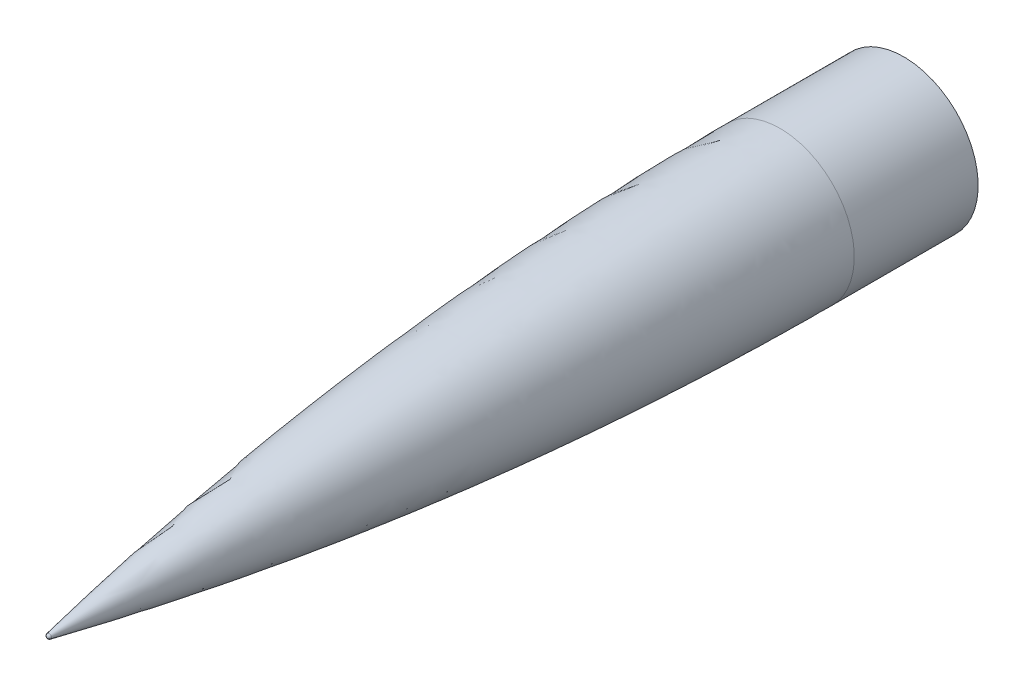
ISO-10303-21;
HEADER;
FILE_DESCRIPTION(('STEP AP214'),'2;1');
FILE_NAME('part.step','',(''),(''),'','','');
FILE_SCHEMA(('AUTOMOTIVE_DESIGN { 1 0 10303 214 1 1 1 1 }'));
ENDSEC;
DATA;
#1=APPLICATION_CONTEXT('core data for automotive mechanical design processes');
#2=APPLICATION_PROTOCOL_DEFINITION('international standard','automotive_design',2000,#1);
#3=PRODUCT_CONTEXT('',#1,'mechanical');
#4=PRODUCT('Part','Part','',(#3));
#5=PRODUCT_RELATED_PRODUCT_CATEGORY('part','',(#4));
#6=PRODUCT_DEFINITION_FORMATION('','',#4);
#7=PRODUCT_DEFINITION_CONTEXT('part definition',#1,'design');
#8=PRODUCT_DEFINITION('design','',#6,#7);
#9=PRODUCT_DEFINITION_SHAPE('','',#8);
#10=(LENGTH_UNIT() NAMED_UNIT(*) SI_UNIT(.MILLI.,.METRE.));
#11=(NAMED_UNIT(*) PLANE_ANGLE_UNIT() SI_UNIT($,.RADIAN.));
#12=(NAMED_UNIT(*) SI_UNIT($,.STERADIAN.) SOLID_ANGLE_UNIT());
#13=UNCERTAINTY_MEASURE_WITH_UNIT(LENGTH_MEASURE(1.E-05),#10,'distance_accuracy_value','');
#14=(GEOMETRIC_REPRESENTATION_CONTEXT(3) GLOBAL_UNCERTAINTY_ASSIGNED_CONTEXT((#13)) GLOBAL_UNIT_ASSIGNED_CONTEXT((#10,
#11,#12)) REPRESENTATION_CONTEXT('',''));
#15=CARTESIAN_POINT('',(0.,0.,0.));
#16=DIRECTION('',(0.,0.,1.));
#17=DIRECTION('',(1.,0.,0.));
#18=AXIS2_PLACEMENT_3D('',#15,#16,#17);
#19=CARTESIAN_POINT('',(0.,76.2,-761.999999999997));
#20=CARTESIAN_POINT('',(0.,76.2,-760.928515031507));
#21=CARTESIAN_POINT('',(0.,76.1988565486631,-758.769681778841));
#22=CARTESIAN_POINT('',(0.,76.1937110176368,-754.154681276467));
#23=CARTESIAN_POINT('',(0.,76.1799896137996,-749.129567883535));
#24=CARTESIAN_POINT('',(0.,76.1594075386224,-744.039048308152));
#25=CARTESIAN_POINT('',(0.,76.1319648287996,-738.871542800412));
#26=CARTESIAN_POINT('',(0.,76.0976615332596,-733.741383177975));
#27=CARTESIAN_POINT('',(0.,76.0564977131606,-728.602410654143));
#28=CARTESIAN_POINT('',(0.,76.0143442179768,-724.092480203886));
#29=CARTESIAN_POINT('',(0.,75.9737232495226,-720.210790809596));
#30=CARTESIAN_POINT('',(0.,75.9292872692357,-716.30085008793));
#31=CARTESIAN_POINT('',(0.,75.8648332430719,-711.049872160127));
#32=CARTESIAN_POINT('',(0.,75.4370504777727,-680.201058153923));
#33=CARTESIAN_POINT('',(0.,73.2972360298675,-592.262717593109));
#34=CARTESIAN_POINT('',(0.,66.0206944697555,-458.506155710729));
#35=CARTESIAN_POINT('',(0.,51.0953693432975,-309.513452377572));
#36=CARTESIAN_POINT('',(0.,32.4335979388166,-179.535050201275));
#37=CARTESIAN_POINT('',(0.,19.9150790376636,-105.755222240511));
#38=CARTESIAN_POINT('',(0.,14.5797371165994,-76.0348239816225));
#39=CARTESIAN_POINT('',(0.,12.2071538568395,-63.1225863220315));
#40=CARTESIAN_POINT('',(0.,11.0142760975117,-56.6964317339591));
#41=CARTESIAN_POINT('',(0.,9.81500610881873,-50.3003630004848));
#42=CARTESIAN_POINT('',(0.,8.85603142216295,-45.2235786956357));
#43=CARTESIAN_POINT('',(0.,7.89539768778004,-40.1750184480082));
#44=CARTESIAN_POINT('',(0.,6.92975681285537,-35.1364654827459));
#45=CARTESIAN_POINT('',(0.,5.950088372306,-30.0624981166692));
#46=CARTESIAN_POINT('',(0.,4.97876861803889,-25.0657913409136));
#47=CARTESIAN_POINT('',(0.,4.01325291064006,-20.1335319117713));
#48=CARTESIAN_POINT('',(0.,3.11948680588799,-15.6065915888106));
#49=CARTESIAN_POINT('',(0.,2.70005945116971,-13.4887113266373));
#50=CARTESIAN_POINT('',(0.,2.49134742401639,-12.4377500896153));
#51=B_SPLINE_CURVE_WITH_KNOTS('',4,(#19,#20,#21,#22,#23,#24,#25,#26,#27,#28,#29,#30,#31,#32,#33,
#34,#35,#36,#37,#38,#39,#40,#41,#42,#43,#44,#45,#46,#47,#48,#49,#50),.UNSPECIFIED.,.F.,.F.,(5,1,
1,1,1,1,1,1,1,1,1,1,1,1,1,1,1,1,1,1,1,1,1,1,1,1,1,1,5),(0.0829751170277693,0.0886564859676943,
0.0943378549076192,0.100019223847544,0.105700592787469,0.111381961727394,0.117063330667319,
0.122744699607244,0.128426068547169,0.131329338495299,0.13423260844343,0.14003914833969,
0.151652228132212,0.267783025595638,0.523270779036652,0.732306214848612,0.813597773576893,
0.848437011796869,0.854243551418146,0.865856630660699,0.871663170281976,0.877344539702481,
0.883025909122986,0.888707278543491,0.894388647963996,0.900070017384501,0.905751386805005,
0.91143275622551,0.917114125646015),.UNSPECIFIED.);
#52=CARTESIAN_POINT('',(0.,0.,-480.059999999982));
#53=DIRECTION('',(0.,0.,-1.));
#54=AXIS1_PLACEMENT('',#52,#53);
#55=SURFACE_OF_REVOLUTION('',#51,#54);
#56=CARTESIAN_POINT('',(0.,0.,-12.4377500896799));
#57=DIRECTION('',(0.,0.,-1.));
#58=DIRECTION('',(-1.,0.,0.));
#59=AXIS2_PLACEMENT_3D('',#56,#57,#58);
#60=CIRCLE('',#59,2.49134742402921);
#61=CARTESIAN_POINT('',(-2.49134742402921,0.,-12.4377500896799));
#62=VERTEX_POINT('',#61);
#63=EDGE_CURVE('E10',#62,#62,#60,.T.);
#64=ORIENTED_EDGE('',*,*,#63,.T.);
#65=EDGE_LOOP('',(#64));
#66=FACE_BOUND('',#65,.T.);
#67=CARTESIAN_POINT('',(0.,0.,-762.));
#68=DIRECTION('',(0.,0.,-1.));
#69=DIRECTION('',(-1.,0.,0.));
#70=AXIS2_PLACEMENT_3D('',#67,#68,#69);
#71=CIRCLE('',#70,76.2);
#72=CARTESIAN_POINT('',(-76.2,0.,-762.));
#73=VERTEX_POINT('',#72);
#74=EDGE_CURVE('E47',#73,#73,#71,.T.);
#75=ORIENTED_EDGE('',*,*,#74,.F.);
#76=EDGE_LOOP('',(#75));
#77=FACE_BOUND('',#76,.T.);
#78=ADVANCED_FACE('F39',(#66,#77),#55,.F.);
#79=CARTESIAN_POINT('',(0.,-1.30485899862975E-11,-12.9325106506768));
#80=DIRECTION('',(0.,0.,-1.));
#81=DIRECTION('',(0.,1.,0.));
#82=AXIS2_PLACEMENT_3D('',#79,#80,#81);
#83=SPHERICAL_SURFACE('',#82,2.54);
#84=ORIENTED_EDGE('',*,*,#63,.F.);
#85=EDGE_LOOP('',(#84));
#86=FACE_BOUND('',#85,.T.);
#87=ADVANCED_FACE('F70',(#86),#83,.T.);
#88=CARTESIAN_POINT('',(0.,0.,-888.999999999999));
#89=DIRECTION('',(0.,0.,1.));
#90=DIRECTION('',(1.,0.,0.));
#91=AXIS2_PLACEMENT_3D('',#88,#89,#90);
#92=CYLINDRICAL_SURFACE('',#91,76.2);
#93=CARTESIAN_POINT('',(0.,0.,-888.999999999999));
#94=DIRECTION('',(0.,0.,-1.));
#95=DIRECTION('',(-1.,0.,0.));
#96=AXIS2_PLACEMENT_3D('',#93,#94,#95);
#97=CIRCLE('',#96,76.2);
#98=CARTESIAN_POINT('',(-76.2,0.,-888.999999999999));
#99=VERTEX_POINT('',#98);
#100=EDGE_CURVE('E52',#99,#99,#97,.T.);
#101=ORIENTED_EDGE('',*,*,#100,.F.);
#102=EDGE_LOOP('',(#101));
#103=FACE_BOUND('',#102,.T.);
#104=ORIENTED_EDGE('',*,*,#74,.T.);
#105=EDGE_LOOP('',(#104));
#106=FACE_BOUND('',#105,.T.);
#107=ADVANCED_FACE('F68',(#103,#106),#92,.T.);
#108=CARTESIAN_POINT('',(0.,0.,-888.999999999999));
#109=DIRECTION('',(0.,0.,-1.));
#110=DIRECTION('',(-1.,0.,0.));
#111=AXIS2_PLACEMENT_3D('',#108,#109,#110);
#112=PLANE('',#111);
#113=ORIENTED_EDGE('',*,*,#100,.T.);
#114=EDGE_LOOP('',(#113));
#115=FACE_BOUND('',#114,.T.);
#116=ADVANCED_FACE('F66',(#115),#112,.T.);
#117=CLOSED_SHELL('',(#78,#87,#107,#116));
#118=MANIFOLD_SOLID_BREP('B2',#117);
#119=ADVANCED_BREP_SHAPE_REPRESENTATION('',(#18,#118),#14);
#120=SHAPE_DEFINITION_REPRESENTATION(#9,#119);
ENDSEC;
END-ISO-10303-21;
